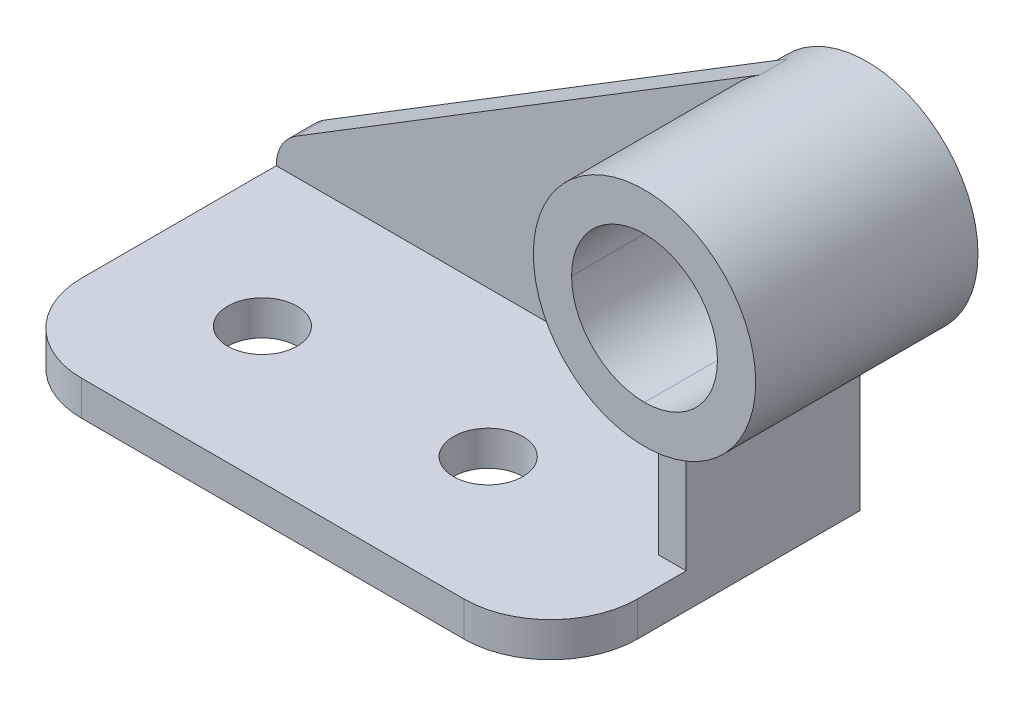
ISO-10303-21;
HEADER;
FILE_DESCRIPTION(('STEP AP214'),'2;1');
FILE_NAME('part.step','',(''),(''),'','','');
FILE_SCHEMA(('AUTOMOTIVE_DESIGN { 1 0 10303 214 1 1 1 1 }'));
ENDSEC;
DATA;
#1=APPLICATION_CONTEXT('core data for automotive mechanical design processes');
#2=APPLICATION_PROTOCOL_DEFINITION('international standard','automotive_design',2000,#1);
#3=PRODUCT_CONTEXT('',#1,'mechanical');
#4=PRODUCT('Part','Part','',(#3));
#5=PRODUCT_RELATED_PRODUCT_CATEGORY('part','',(#4));
#6=PRODUCT_DEFINITION_FORMATION('','',#4);
#7=PRODUCT_DEFINITION_CONTEXT('part definition',#1,'design');
#8=PRODUCT_DEFINITION('design','',#6,#7);
#9=PRODUCT_DEFINITION_SHAPE('','',#8);
#10=(LENGTH_UNIT() NAMED_UNIT(*) SI_UNIT(.MILLI.,.METRE.));
#11=(NAMED_UNIT(*) PLANE_ANGLE_UNIT() SI_UNIT($,.RADIAN.));
#12=(NAMED_UNIT(*) SI_UNIT($,.STERADIAN.) SOLID_ANGLE_UNIT());
#13=UNCERTAINTY_MEASURE_WITH_UNIT(LENGTH_MEASURE(1.E-05),#10,'distance_accuracy_value','');
#14=(GEOMETRIC_REPRESENTATION_CONTEXT(3) GLOBAL_UNCERTAINTY_ASSIGNED_CONTEXT((#13)) GLOBAL_UNIT_ASSIGNED_CONTEXT((#10,
#11,#12)) REPRESENTATION_CONTEXT('',''));
#15=CARTESIAN_POINT('',(0.,0.,0.));
#16=DIRECTION('',(0.,0.,1.));
#17=DIRECTION('',(1.,0.,0.));
#18=AXIS2_PLACEMENT_3D('',#15,#16,#17);
#19=CARTESIAN_POINT('',(156.,75.,0.));
#20=DIRECTION('',(0.,0.,-1.));
#21=DIRECTION('',(-1.,0.,0.));
#22=AXIS2_PLACEMENT_3D('',#19,#20,#21);
#23=CYLINDRICAL_SURFACE('',#22,21.);
#24=CARTESIAN_POINT('',(156.,75.,-31.));
#25=DIRECTION('',(0.,0.,-1.));
#26=DIRECTION('',(-1.,0.,0.));
#27=AXIS2_PLACEMENT_3D('',#24,#25,#26);
#28=CIRCLE('',#27,21.);
#29=CARTESIAN_POINT('',(177.,75.,-31.));
#30=VERTEX_POINT('',#29);
#31=CARTESIAN_POINT('',(156.,54.,-31.));
#32=VERTEX_POINT('',#31);
#33=EDGE_CURVE('E194',#30,#32,#28,.T.);
#34=ORIENTED_EDGE('',*,*,#33,.F.);
#35=DIRECTION('',(0.,0.,-1.));
#36=VECTOR('',#35,1.);
#37=CARTESIAN_POINT('',(177.,75.,0.));
#38=LINE('',#37,#36);
#39=CARTESIAN_POINT('',(177.,75.,-95.));
#40=VERTEX_POINT('',#39);
#41=EDGE_CURVE('E11',#30,#40,#38,.T.);
#42=ORIENTED_EDGE('',*,*,#41,.T.);
#43=CARTESIAN_POINT('',(156.,75.,-95.));
#44=DIRECTION('',(0.,0.,-1.));
#45=DIRECTION('',(-1.,0.,0.));
#46=AXIS2_PLACEMENT_3D('',#43,#44,#45);
#47=CIRCLE('',#46,21.);
#48=CARTESIAN_POINT('',(156.,54.,-95.));
#49=VERTEX_POINT('',#48);
#50=EDGE_CURVE('E188',#40,#49,#47,.T.);
#51=ORIENTED_EDGE('',*,*,#50,.T.);
#52=DIRECTION('',(0.,0.,-1.));
#53=VECTOR('',#52,1.);
#54=CARTESIAN_POINT('',(156.,54.,0.));
#55=LINE('',#54,#53);
#56=EDGE_CURVE('E334',#49,#32,#55,.F.);
#57=ORIENTED_EDGE('',*,*,#56,.T.);
#58=EDGE_LOOP('',(#34,#42,#51,#57));
#59=FACE_BOUND('',#58,.T.);
#60=ADVANCED_FACE('F44',(#59),#23,.F.);
#61=CARTESIAN_POINT('',(135.,75.,-95.));
#62=VERTEX_POINT('',#61);
#63=EDGE_CURVE('E189',#49,#62,#47,.T.);
#64=ORIENTED_EDGE('',*,*,#63,.T.);
#65=DIRECTION('',(0.,0.,-1.));
#66=VECTOR('',#65,1.);
#67=CARTESIAN_POINT('',(135.,75.,0.));
#68=LINE('',#67,#66);
#69=CARTESIAN_POINT('',(135.,75.,-31.));
#70=VERTEX_POINT('',#69);
#71=EDGE_CURVE('E48',#62,#70,#68,.F.);
#72=ORIENTED_EDGE('',*,*,#71,.T.);
#73=EDGE_CURVE('E195',#32,#70,#28,.T.);
#74=ORIENTED_EDGE('',*,*,#73,.F.);
#75=ORIENTED_EDGE('',*,*,#56,.F.);
#76=EDGE_LOOP('',(#64,#72,#74,#75));
#77=FACE_BOUND('',#76,.T.);
#78=ADVANCED_FACE('F353',(#77),#23,.F.);
#79=ORIENTED_EDGE('',*,*,#41,.F.);
#80=CARTESIAN_POINT('',(156.,96.,-31.));
#81=VERTEX_POINT('',#80);
#82=EDGE_CURVE('E190',#81,#30,#28,.T.);
#83=ORIENTED_EDGE('',*,*,#82,.F.);
#84=DIRECTION('',(0.,0.,-1.));
#85=VECTOR('',#84,1.);
#86=CARTESIAN_POINT('',(156.,96.,0.));
#87=LINE('',#86,#85);
#88=CARTESIAN_POINT('',(156.,96.,-95.));
#89=VERTEX_POINT('',#88);
#90=EDGE_CURVE('E224',#81,#89,#87,.T.);
#91=ORIENTED_EDGE('',*,*,#90,.T.);
#92=EDGE_CURVE('E185',#89,#40,#47,.T.);
#93=ORIENTED_EDGE('',*,*,#92,.T.);
#94=EDGE_LOOP('',(#79,#83,#91,#93));
#95=FACE_BOUND('',#94,.T.);
#96=ADVANCED_FACE('F367',(#95),#23,.F.);
#97=CARTESIAN_POINT('',(135.,10.,-25.));
#98=DIRECTION('',(0.,-1.,0.));
#99=DIRECTION('',(0.,0.,-1.));
#100=AXIS2_PLACEMENT_3D('',#97,#98,#99);
#101=PLANE('',#100);
#102=CARTESIAN_POINT('',(38.,10.,-39.));
#103=DIRECTION('',(0.,1.,0.));
#104=DIRECTION('',(0.,0.,1.));
#105=AXIS2_PLACEMENT_3D('',#102,#103,#104);
#106=CIRCLE('',#105,10.);
#107=CARTESIAN_POINT('',(38.,10.,-29.));
#108=VERTEX_POINT('',#107);
#109=EDGE_CURVE('E312',#108,#108,#106,.T.);
#110=ORIENTED_EDGE('',*,*,#109,.F.);
#111=EDGE_LOOP('',(#110));
#112=FACE_BOUND('',#111,.T.);
#113=DIRECTION('',(0.,0.,1.));
#114=VECTOR('',#113,1.);
#115=CARTESIAN_POINT('',(152.,10.,-81.));
#116=LINE('',#115,#114);
#117=CARTESIAN_POINT('',(152.,10.,-81.));
#118=VERTEX_POINT('',#117);
#119=CARTESIAN_POINT('',(152.,10.,-39.));
#120=VERTEX_POINT('',#119);
#121=EDGE_CURVE('E166',#118,#120,#116,.T.);
#122=ORIENTED_EDGE('',*,*,#121,.F.);
#123=DIRECTION('',(-1.,0.,0.));
#124=VECTOR('',#123,1.);
#125=CARTESIAN_POINT('',(160.,10.,-81.));
#126=LINE('',#125,#124);
#127=CARTESIAN_POINT('',(0.,10.,-81.));
#128=VERTEX_POINT('',#127);
#129=EDGE_CURVE('E151',#118,#128,#126,.T.);
#130=ORIENTED_EDGE('',*,*,#129,.T.);
#131=DIRECTION('',(0.,0.,-1.));
#132=VECTOR('',#131,1.);
#133=CARTESIAN_POINT('',(0.,10.,-25.));
#134=LINE('',#133,#132);
#135=CARTESIAN_POINT('',(0.,10.,-25.));
#136=VERTEX_POINT('',#135);
#137=EDGE_CURVE('E237',#136,#128,#134,.T.);
#138=ORIENTED_EDGE('',*,*,#137,.F.);
#139=CARTESIAN_POINT('',(25.,10.,-25.));
#140=DIRECTION('',(0.,-1.,0.));
#141=DIRECTION('',(0.,0.,-1.));
#142=AXIS2_PLACEMENT_3D('',#139,#140,#141);
#143=CIRCLE('',#142,25.);
#144=CARTESIAN_POINT('',(25.,10.,0.));
#145=VERTEX_POINT('',#144);
#146=EDGE_CURVE('E234',#145,#136,#143,.T.);
#147=ORIENTED_EDGE('',*,*,#146,.F.);
#148=DIRECTION('',(1.,0.,0.));
#149=VECTOR('',#148,1.);
#150=CARTESIAN_POINT('',(25.,10.,0.));
#151=LINE('',#150,#149);
#152=CARTESIAN_POINT('',(135.,10.,0.));
#153=VERTEX_POINT('',#152);
#154=EDGE_CURVE('E232',#145,#153,#151,.T.);
#155=ORIENTED_EDGE('',*,*,#154,.T.);
#156=CARTESIAN_POINT('',(135.,10.,-25.));
#157=DIRECTION('',(0.,-1.,0.));
#158=DIRECTION('',(0.,0.,-1.));
#159=AXIS2_PLACEMENT_3D('',#156,#157,#158);
#160=CIRCLE('',#159,25.);
#161=CARTESIAN_POINT('',(160.,10.,-25.));
#162=VERTEX_POINT('',#161);
#163=EDGE_CURVE('E222',#162,#153,#160,.T.);
#164=ORIENTED_EDGE('',*,*,#163,.F.);
#165=DIRECTION('',(0.,0.,1.));
#166=VECTOR('',#165,1.);
#167=CARTESIAN_POINT('',(160.,10.,-89.));
#168=LINE('',#167,#166);
#169=CARTESIAN_POINT('',(160.,10.,-39.));
#170=VERTEX_POINT('',#169);
#171=EDGE_CURVE('E219',#170,#162,#168,.T.);
#172=ORIENTED_EDGE('',*,*,#171,.F.);
#173=DIRECTION('',(-1.,0.,0.));
#174=VECTOR('',#173,1.);
#175=CARTESIAN_POINT('',(160.,10.,-39.));
#176=LINE('',#175,#174);
#177=EDGE_CURVE('E170',#170,#120,#176,.T.);
#178=ORIENTED_EDGE('',*,*,#177,.T.);
#179=EDGE_LOOP('',(#122,#130,#138,#147,#155,#164,#172,#178));
#180=FACE_BOUND('',#179,.T.);
#181=CARTESIAN_POINT('',(103.,10.,-39.));
#182=DIRECTION('',(0.,1.,0.));
#183=DIRECTION('',(0.,0.,1.));
#184=AXIS2_PLACEMENT_3D('',#181,#182,#183);
#185=CIRCLE('',#184,10.);
#186=CARTESIAN_POINT('',(103.,10.,-29.));
#187=VERTEX_POINT('',#186);
#188=EDGE_CURVE('E313',#187,#187,#185,.T.);
#189=ORIENTED_EDGE('',*,*,#188,.F.);
#190=EDGE_LOOP('',(#189));
#191=FACE_BOUND('',#190,.T.);
#192=ADVANCED_FACE('F167',(#112,#180,#191),#101,.F.);
#193=CARTESIAN_POINT('',(135.,0.,-25.));
#194=DIRECTION('',(0.,-1.,0.));
#195=DIRECTION('',(0.,0.,-1.));
#196=AXIS2_PLACEMENT_3D('',#193,#194,#195);
#197=PLANE('',#196);
#198=CARTESIAN_POINT('',(38.,0.,-39.));
#199=DIRECTION('',(0.,1.,0.));
#200=DIRECTION('',(0.,0.,1.));
#201=AXIS2_PLACEMENT_3D('',#198,#199,#200);
#202=CIRCLE('',#201,10.);
#203=CARTESIAN_POINT('',(38.,0.,-29.));
#204=VERTEX_POINT('',#203);
#205=EDGE_CURVE('E316',#204,#204,#202,.T.);
#206=ORIENTED_EDGE('',*,*,#205,.T.);
#207=EDGE_LOOP('',(#206));
#208=FACE_BOUND('',#207,.T.);
#209=DIRECTION('',(0.,0.,1.));
#210=VECTOR('',#209,1.);
#211=CARTESIAN_POINT('',(160.,0.,-89.));
#212=LINE('',#211,#210);
#213=CARTESIAN_POINT('',(160.,0.,-89.));
#214=VERTEX_POINT('',#213);
#215=CARTESIAN_POINT('',(160.,0.,-25.));
#216=VERTEX_POINT('',#215);
#217=EDGE_CURVE('E265',#214,#216,#212,.T.);
#218=ORIENTED_EDGE('',*,*,#217,.T.);
#219=CARTESIAN_POINT('',(135.,0.,-25.));
#220=DIRECTION('',(0.,-1.,0.));
#221=DIRECTION('',(0.,0.,-1.));
#222=AXIS2_PLACEMENT_3D('',#219,#220,#221);
#223=CIRCLE('',#222,25.);
#224=CARTESIAN_POINT('',(135.,0.,0.));
#225=VERTEX_POINT('',#224);
#226=EDGE_CURVE('E270',#216,#225,#223,.T.);
#227=ORIENTED_EDGE('',*,*,#226,.T.);
#228=DIRECTION('',(1.,0.,0.));
#229=VECTOR('',#228,1.);
#230=CARTESIAN_POINT('',(25.,0.,0.));
#231=LINE('',#230,#229);
#232=CARTESIAN_POINT('',(25.,0.,0.));
#233=VERTEX_POINT('',#232);
#234=EDGE_CURVE('E273',#233,#225,#231,.T.);
#235=ORIENTED_EDGE('',*,*,#234,.F.);
#236=CARTESIAN_POINT('',(25.,0.,-25.));
#237=DIRECTION('',(0.,-1.,0.));
#238=DIRECTION('',(0.,0.,-1.));
#239=AXIS2_PLACEMENT_3D('',#236,#237,#238);
#240=CIRCLE('',#239,25.);
#241=CARTESIAN_POINT('',(0.,0.,-25.));
#242=VERTEX_POINT('',#241);
#243=EDGE_CURVE('E276',#233,#242,#240,.T.);
#244=ORIENTED_EDGE('',*,*,#243,.T.);
#245=DIRECTION('',(0.,0.,-1.));
#246=VECTOR('',#245,1.);
#247=CARTESIAN_POINT('',(0.,0.,-25.));
#248=LINE('',#247,#246);
#249=CARTESIAN_POINT('',(0.,0.,-89.));
#250=VERTEX_POINT('',#249);
#251=EDGE_CURVE('E278',#242,#250,#248,.T.);
#252=ORIENTED_EDGE('',*,*,#251,.T.);
#253=DIRECTION('',(-1.,0.,0.));
#254=VECTOR('',#253,1.);
#255=CARTESIAN_POINT('',(160.,0.,-89.));
#256=LINE('',#255,#254);
#257=EDGE_CURVE('E223',#214,#250,#256,.T.);
#258=ORIENTED_EDGE('',*,*,#257,.F.);
#259=EDGE_LOOP('',(#218,#227,#235,#244,#252,#258));
#260=FACE_BOUND('',#259,.T.);
#261=CARTESIAN_POINT('',(103.,0.,-39.));
#262=DIRECTION('',(0.,1.,0.));
#263=DIRECTION('',(0.,0.,1.));
#264=AXIS2_PLACEMENT_3D('',#261,#262,#263);
#265=CIRCLE('',#264,10.);
#266=CARTESIAN_POINT('',(103.,0.,-29.));
#267=VERTEX_POINT('',#266);
#268=EDGE_CURVE('E310',#267,#267,#265,.T.);
#269=ORIENTED_EDGE('',*,*,#268,.T.);
#270=EDGE_LOOP('',(#269));
#271=FACE_BOUND('',#270,.T.);
#272=ADVANCED_FACE('F303',(#208,#260,#271),#197,.T.);
#273=CARTESIAN_POINT('',(156.,75.,-81.));
#274=DIRECTION('',(0.,0.,-1.));
#275=DIRECTION('',(-1.,0.,0.));
#276=AXIS2_PLACEMENT_3D('',#273,#274,#275);
#277=PLANE('',#276);
#278=CARTESIAN_POINT('',(156.,75.,-81.));
#279=DIRECTION('',(0.,0.,-1.));
#280=DIRECTION('',(-1.,0.,0.));
#281=AXIS2_PLACEMENT_3D('',#278,#279,#280);
#282=CIRCLE('',#281,32.);
#283=CARTESIAN_POINT('',(152.,43.2509842672249,-81.));
#284=VERTEX_POINT('',#283);
#285=CARTESIAN_POINT('',(139.248405558681,102.265070762306,-81.));
#286=VERTEX_POINT('',#285);
#287=EDGE_CURVE('E217',#284,#286,#282,.T.);
#288=ORIENTED_EDGE('',*,*,#287,.T.);
#289=DIRECTION('',(0.852033461322075,0.523487326291214,0.));
#290=VECTOR('',#289,1.);
#291=CARTESIAN_POINT('',(5.71815208450543,20.2244015358649,-81.));
#292=LINE('',#291,#290);
#293=CARTESIAN_POINT('',(5.71815208450543,20.2244015358649,-81.));
#294=VERTEX_POINT('',#293);
#295=EDGE_CURVE('E208',#294,#286,#292,.T.);
#296=ORIENTED_EDGE('',*,*,#295,.F.);
#297=CARTESIAN_POINT('',(12.,10.,-81.));
#298=DIRECTION('',(0.,0.,-1.));
#299=DIRECTION('',(-1.,0.,0.));
#300=AXIS2_PLACEMENT_3D('',#297,#298,#299);
#301=CIRCLE('',#300,12.);
#302=EDGE_CURVE('E159',#128,#294,#301,.T.);
#303=ORIENTED_EDGE('',*,*,#302,.F.);
#304=ORIENTED_EDGE('',*,*,#129,.F.);
#305=DIRECTION('',(0.,-1.,0.));
#306=VECTOR('',#305,1.);
#307=CARTESIAN_POINT('',(152.,107.001,-81.));
#308=LINE('',#307,#306);
#309=EDGE_CURVE('E155',#284,#118,#308,.T.);
#310=ORIENTED_EDGE('',*,*,#309,.F.);
#311=EDGE_LOOP('',(#288,#296,#303,#304,#310));
#312=FACE_BOUND('',#311,.T.);
#313=ADVANCED_FACE('F153',(#312),#277,.F.);
#314=CARTESIAN_POINT('',(160.,10.,-89.));
#315=DIRECTION('',(1.,0.,0.));
#316=DIRECTION('',(0.,0.,-1.));
#317=AXIS2_PLACEMENT_3D('',#314,#315,#316);
#318=PLANE('',#317);
#319=DIRECTION('',(0.,-1.,0.));
#320=VECTOR('',#319,1.);
#321=CARTESIAN_POINT('',(160.,107.001,-39.));
#322=LINE('',#321,#320);
#323=CARTESIAN_POINT('',(160.,43.2509842672249,-39.));
#324=VERTEX_POINT('',#323);
#325=EDGE_CURVE('E180',#324,#170,#322,.T.);
#326=ORIENTED_EDGE('',*,*,#325,.T.);
#327=ORIENTED_EDGE('',*,*,#171,.T.);
#328=DIRECTION('',(0.,-1.,0.));
#329=VECTOR('',#328,1.);
#330=CARTESIAN_POINT('',(160.,10.,-25.));
#331=LINE('',#330,#329);
#332=EDGE_CURVE('E246',#162,#216,#331,.T.);
#333=ORIENTED_EDGE('',*,*,#332,.T.);
#334=ORIENTED_EDGE('',*,*,#217,.F.);
#335=DIRECTION('',(0.,-1.,0.));
#336=VECTOR('',#335,1.);
#337=CARTESIAN_POINT('',(160.,10.,-89.));
#338=LINE('',#337,#336);
#339=CARTESIAN_POINT('',(160.,43.2509842672249,-89.));
#340=VERTEX_POINT('',#339);
#341=EDGE_CURVE('E240',#340,#214,#338,.T.);
#342=ORIENTED_EDGE('',*,*,#341,.F.);
#343=DIRECTION('',(0.,0.,-1.));
#344=VECTOR('',#343,1.);
#345=CARTESIAN_POINT('',(160.,43.2509842672249,-81.));
#346=LINE('',#345,#344);
#347=EDGE_CURVE('E260',#324,#340,#346,.T.);
#348=ORIENTED_EDGE('',*,*,#347,.F.);
#349=EDGE_LOOP('',(#326,#327,#333,#334,#342,#348));
#350=FACE_BOUND('',#349,.T.);
#351=ADVANCED_FACE('F46',(#350),#318,.T.);
#352=CARTESIAN_POINT('',(160.,10.,-89.));
#353=DIRECTION('',(0.,0.,1.));
#354=DIRECTION('',(1.,0.,0.));
#355=AXIS2_PLACEMENT_3D('',#352,#353,#354);
#356=PLANE('',#355);
#357=CARTESIAN_POINT('',(156.,75.,-89.));
#358=DIRECTION('',(0.,0.,1.));
#359=DIRECTION('',(1.,0.,0.));
#360=AXIS2_PLACEMENT_3D('',#357,#358,#359);
#361=CIRCLE('',#360,32.);
#362=CARTESIAN_POINT('',(139.248405558681,102.265070762306,-89.));
#363=VERTEX_POINT('',#362);
#364=EDGE_CURVE('E201',#363,#340,#361,.T.);
#365=ORIENTED_EDGE('',*,*,#364,.T.);
#366=ORIENTED_EDGE('',*,*,#341,.T.);
#367=ORIENTED_EDGE('',*,*,#257,.T.);
#368=DIRECTION('',(0.,-1.,0.));
#369=VECTOR('',#368,1.);
#370=CARTESIAN_POINT('',(0.,10.,-89.));
#371=LINE('',#370,#369);
#372=CARTESIAN_POINT('',(0.,10.,-89.));
#373=VERTEX_POINT('',#372);
#374=EDGE_CURVE('E285',#373,#250,#371,.T.);
#375=ORIENTED_EDGE('',*,*,#374,.F.);
#376=CARTESIAN_POINT('',(12.,10.,-89.));
#377=DIRECTION('',(0.,0.,-1.));
#378=DIRECTION('',(-1.,0.,0.));
#379=AXIS2_PLACEMENT_3D('',#376,#377,#378);
#380=CIRCLE('',#379,12.);
#381=CARTESIAN_POINT('',(5.71815208450543,20.2244015358649,-89.));
#382=VERTEX_POINT('',#381);
#383=EDGE_CURVE('E205',#373,#382,#380,.T.);
#384=ORIENTED_EDGE('',*,*,#383,.T.);
#385=DIRECTION('',(0.852033461322075,0.523487326291214,0.));
#386=VECTOR('',#385,1.);
#387=CARTESIAN_POINT('',(5.71815208450543,20.2244015358649,-89.));
#388=LINE('',#387,#386);
#389=EDGE_CURVE('E203',#382,#363,#388,.T.);
#390=ORIENTED_EDGE('',*,*,#389,.T.);
#391=EDGE_LOOP('',(#365,#366,#367,#375,#384,#390));
#392=FACE_BOUND('',#391,.T.);
#393=ADVANCED_FACE('F284',(#392),#356,.F.);
#394=CARTESIAN_POINT('',(0.,10.,-25.));
#395=DIRECTION('',(-1.,0.,0.));
#396=DIRECTION('',(0.,0.,1.));
#397=AXIS2_PLACEMENT_3D('',#394,#395,#396);
#398=PLANE('',#397);
#399=ORIENTED_EDGE('',*,*,#251,.F.);
#400=DIRECTION('',(0.,-1.,0.));
#401=VECTOR('',#400,1.);
#402=CARTESIAN_POINT('',(0.,10.,-25.));
#403=LINE('',#402,#401);
#404=EDGE_CURVE('E289',#136,#242,#403,.T.);
#405=ORIENTED_EDGE('',*,*,#404,.F.);
#406=ORIENTED_EDGE('',*,*,#137,.T.);
#407=DIRECTION('',(0.,0.,-1.));
#408=VECTOR('',#407,1.);
#409=CARTESIAN_POINT('',(0.,10.,-81.));
#410=LINE('',#409,#408);
#411=EDGE_CURVE('E163',#128,#373,#410,.T.);
#412=ORIENTED_EDGE('',*,*,#411,.T.);
#413=ORIENTED_EDGE('',*,*,#374,.T.);
#414=EDGE_LOOP('',(#399,#405,#406,#412,#413));
#415=FACE_BOUND('',#414,.T.);
#416=ADVANCED_FACE('F288',(#415),#398,.T.);
#417=CARTESIAN_POINT('',(25.,10.,-25.));
#418=DIRECTION('',(0.,-1.,0.));
#419=DIRECTION('',(0.,0.,-1.));
#420=AXIS2_PLACEMENT_3D('',#417,#418,#419);
#421=CYLINDRICAL_SURFACE('',#420,25.);
#422=ORIENTED_EDGE('',*,*,#243,.F.);
#423=DIRECTION('',(0.,-1.,0.));
#424=VECTOR('',#423,1.);
#425=CARTESIAN_POINT('',(25.,10.,0.));
#426=LINE('',#425,#424);
#427=EDGE_CURVE('E290',#145,#233,#426,.T.);
#428=ORIENTED_EDGE('',*,*,#427,.F.);
#429=ORIENTED_EDGE('',*,*,#146,.T.);
#430=ORIENTED_EDGE('',*,*,#404,.T.);
#431=EDGE_LOOP('',(#422,#428,#429,#430));
#432=FACE_BOUND('',#431,.T.);
#433=ADVANCED_FACE('F393',(#432),#421,.T.);
#434=CARTESIAN_POINT('',(25.,10.,0.));
#435=DIRECTION('',(0.,0.,-1.));
#436=DIRECTION('',(-1.,0.,0.));
#437=AXIS2_PLACEMENT_3D('',#434,#435,#436);
#438=PLANE('',#437);
#439=ORIENTED_EDGE('',*,*,#234,.T.);
#440=DIRECTION('',(0.,-1.,0.));
#441=VECTOR('',#440,1.);
#442=CARTESIAN_POINT('',(135.,10.,0.));
#443=LINE('',#442,#441);
#444=EDGE_CURVE('E293',#153,#225,#443,.T.);
#445=ORIENTED_EDGE('',*,*,#444,.F.);
#446=ORIENTED_EDGE('',*,*,#154,.F.);
#447=ORIENTED_EDGE('',*,*,#427,.T.);
#448=EDGE_LOOP('',(#439,#445,#446,#447));
#449=FACE_BOUND('',#448,.T.);
#450=ADVANCED_FACE('F396',(#449),#438,.F.);
#451=CARTESIAN_POINT('',(135.,10.,-25.));
#452=DIRECTION('',(0.,-1.,0.));
#453=DIRECTION('',(0.,0.,-1.));
#454=AXIS2_PLACEMENT_3D('',#451,#452,#453);
#455=CYLINDRICAL_SURFACE('',#454,25.);
#456=ORIENTED_EDGE('',*,*,#226,.F.);
#457=ORIENTED_EDGE('',*,*,#332,.F.);
#458=ORIENTED_EDGE('',*,*,#163,.T.);
#459=ORIENTED_EDGE('',*,*,#444,.T.);
#460=EDGE_LOOP('',(#456,#457,#458,#459));
#461=FACE_BOUND('',#460,.T.);
#462=ADVANCED_FACE('F301',(#461),#455,.T.);
#463=CARTESIAN_POINT('',(156.,75.,-81.));
#464=DIRECTION('',(0.,0.,-1.));
#465=DIRECTION('',(-1.,0.,0.));
#466=AXIS2_PLACEMENT_3D('',#463,#464,#465);
#467=CYLINDRICAL_SURFACE('',#466,32.);
#468=CARTESIAN_POINT('',(156.,75.,-95.));
#469=DIRECTION('',(0.,0.,-1.));
#470=DIRECTION('',(-1.,0.,0.));
#471=AXIS2_PLACEMENT_3D('',#468,#469,#470);
#472=CIRCLE('',#471,32.);
#473=CARTESIAN_POINT('',(124.,75.,-95.));
#474=VERTEX_POINT('',#473);
#475=EDGE_CURVE('E193',#474,#474,#472,.T.);
#476=ORIENTED_EDGE('',*,*,#475,.F.);
#477=EDGE_LOOP('',(#476));
#478=FACE_BOUND('',#477,.T.);
#479=ORIENTED_EDGE('',*,*,#347,.T.);
#480=ORIENTED_EDGE('',*,*,#364,.F.);
#481=DIRECTION('',(0.,0.,-1.));
#482=VECTOR('',#481,1.);
#483=CARTESIAN_POINT('',(139.248405558681,102.265070762306,-81.));
#484=LINE('',#483,#482);
#485=EDGE_CURVE('E256',#286,#363,#484,.T.);
#486=ORIENTED_EDGE('',*,*,#485,.F.);
#487=ORIENTED_EDGE('',*,*,#287,.F.);
#488=DIRECTION('',(0.,0.,-1.));
#489=VECTOR('',#488,1.);
#490=CARTESIAN_POINT('',(152.,43.2509842672249,-81.));
#491=LINE('',#490,#489);
#492=CARTESIAN_POINT('',(152.,43.2509842672249,-39.));
#493=VERTEX_POINT('',#492);
#494=EDGE_CURVE('E178',#493,#284,#491,.T.);
#495=ORIENTED_EDGE('',*,*,#494,.F.);
#496=CARTESIAN_POINT('',(156.,75.,-39.));
#497=DIRECTION('',(0.,0.,1.));
#498=DIRECTION('',(1.,0.,0.));
#499=AXIS2_PLACEMENT_3D('',#496,#497,#498);
#500=CIRCLE('',#499,32.);
#501=EDGE_CURVE('E324',#493,#324,#500,.T.);
#502=ORIENTED_EDGE('',*,*,#501,.T.);
#503=EDGE_LOOP('',(#479,#480,#486,#487,#495,#502));
#504=FACE_BOUND('',#503,.T.);
#505=CARTESIAN_POINT('',(156.,75.,-31.));
#506=DIRECTION('',(0.,0.,-1.));
#507=DIRECTION('',(-1.,0.,0.));
#508=AXIS2_PLACEMENT_3D('',#505,#506,#507);
#509=CIRCLE('',#508,32.);
#510=CARTESIAN_POINT('',(124.,75.,-31.));
#511=VERTEX_POINT('',#510);
#512=EDGE_CURVE('E198',#511,#511,#509,.T.);
#513=ORIENTED_EDGE('',*,*,#512,.T.);
#514=EDGE_LOOP('',(#513));
#515=FACE_BOUND('',#514,.T.);
#516=ADVANCED_FACE('F332',(#478,#504,#515),#467,.T.);
#517=CARTESIAN_POINT('',(5.71815208450543,20.2244015358649,-81.));
#518=DIRECTION('',(-0.523487326291215,0.852033461322075,0.));
#519=DIRECTION('',(-0.852033461322075,-0.523487326291215,0.));
#520=AXIS2_PLACEMENT_3D('',#517,#518,#519);
#521=PLANE('',#520);
#522=ORIENTED_EDGE('',*,*,#485,.T.);
#523=ORIENTED_EDGE('',*,*,#389,.F.);
#524=DIRECTION('',(0.,0.,-1.));
#525=VECTOR('',#524,1.);
#526=CARTESIAN_POINT('',(5.71815208450543,20.2244015358649,-81.));
#527=LINE('',#526,#525);
#528=EDGE_CURVE('E213',#294,#382,#527,.T.);
#529=ORIENTED_EDGE('',*,*,#528,.F.);
#530=ORIENTED_EDGE('',*,*,#295,.T.);
#531=EDGE_LOOP('',(#522,#523,#529,#530));
#532=FACE_BOUND('',#531,.T.);
#533=ADVANCED_FACE('F404',(#532),#521,.T.);
#534=CARTESIAN_POINT('',(12.,10.,-81.));
#535=DIRECTION('',(0.,0.,-1.));
#536=DIRECTION('',(-1.,0.,0.));
#537=AXIS2_PLACEMENT_3D('',#534,#535,#536);
#538=CYLINDRICAL_SURFACE('',#537,12.);
#539=ORIENTED_EDGE('',*,*,#383,.F.);
#540=ORIENTED_EDGE('',*,*,#411,.F.);
#541=ORIENTED_EDGE('',*,*,#302,.T.);
#542=ORIENTED_EDGE('',*,*,#528,.T.);
#543=EDGE_LOOP('',(#539,#540,#541,#542));
#544=FACE_BOUND('',#543,.T.);
#545=ADVANCED_FACE('F409',(#544),#538,.T.);
#546=CARTESIAN_POINT('',(156.,75.,-31.));
#547=DIRECTION('',(0.,0.,-1.));
#548=DIRECTION('',(-1.,0.,0.));
#549=AXIS2_PLACEMENT_3D('',#546,#547,#548);
#550=PLANE('',#549);
#551=ORIENTED_EDGE('',*,*,#82,.T.);
#552=ORIENTED_EDGE('',*,*,#33,.T.);
#553=ORIENTED_EDGE('',*,*,#73,.T.);
#554=EDGE_CURVE('E187',#70,#81,#28,.T.);
#555=ORIENTED_EDGE('',*,*,#554,.T.);
#556=EDGE_LOOP('',(#551,#552,#553,#555));
#557=FACE_BOUND('',#556,.T.);
#558=ORIENTED_EDGE('',*,*,#512,.F.);
#559=EDGE_LOOP('',(#558));
#560=FACE_BOUND('',#559,.T.);
#561=ADVANCED_FACE('F360',(#557,#560),#550,.F.);
#562=CARTESIAN_POINT('',(156.,75.,-95.));
#563=DIRECTION('',(0.,0.,-1.));
#564=DIRECTION('',(-1.,0.,0.));
#565=AXIS2_PLACEMENT_3D('',#562,#563,#564);
#566=PLANE('',#565);
#567=ORIENTED_EDGE('',*,*,#50,.F.);
#568=ORIENTED_EDGE('',*,*,#92,.F.);
#569=EDGE_CURVE('E325',#62,#89,#47,.T.);
#570=ORIENTED_EDGE('',*,*,#569,.F.);
#571=ORIENTED_EDGE('',*,*,#63,.F.);
#572=EDGE_LOOP('',(#567,#568,#570,#571));
#573=FACE_BOUND('',#572,.T.);
#574=ORIENTED_EDGE('',*,*,#475,.T.);
#575=EDGE_LOOP('',(#574));
#576=FACE_BOUND('',#575,.T.);
#577=ADVANCED_FACE('F371',(#573,#576),#566,.T.);
#578=ORIENTED_EDGE('',*,*,#71,.F.);
#579=ORIENTED_EDGE('',*,*,#569,.T.);
#580=ORIENTED_EDGE('',*,*,#90,.F.);
#581=ORIENTED_EDGE('',*,*,#554,.F.);
#582=EDGE_LOOP('',(#578,#579,#580,#581));
#583=FACE_BOUND('',#582,.T.);
#584=ADVANCED_FACE('F358',(#583),#23,.F.);
#585=CARTESIAN_POINT('',(152.,107.001,-81.));
#586=DIRECTION('',(1.,0.,0.));
#587=DIRECTION('',(0.,0.,-1.));
#588=AXIS2_PLACEMENT_3D('',#585,#586,#587);
#589=PLANE('',#588);
#590=DIRECTION('',(0.,-1.,0.));
#591=VECTOR('',#590,1.);
#592=CARTESIAN_POINT('',(152.,107.001,-39.));
#593=LINE('',#592,#591);
#594=EDGE_CURVE('E174',#493,#120,#593,.T.);
#595=ORIENTED_EDGE('',*,*,#594,.F.);
#596=ORIENTED_EDGE('',*,*,#494,.T.);
#597=ORIENTED_EDGE('',*,*,#309,.T.);
#598=ORIENTED_EDGE('',*,*,#121,.T.);
#599=EDGE_LOOP('',(#595,#596,#597,#598));
#600=FACE_BOUND('',#599,.T.);
#601=ADVANCED_FACE('F177',(#600),#589,.F.);
#602=CARTESIAN_POINT('',(160.,107.001,-39.));
#603=DIRECTION('',(0.,0.,1.));
#604=DIRECTION('',(1.,0.,0.));
#605=AXIS2_PLACEMENT_3D('',#602,#603,#604);
#606=PLANE('',#605);
#607=ORIENTED_EDGE('',*,*,#594,.T.);
#608=ORIENTED_EDGE('',*,*,#177,.F.);
#609=ORIENTED_EDGE('',*,*,#325,.F.);
#610=ORIENTED_EDGE('',*,*,#501,.F.);
#611=EDGE_LOOP('',(#607,#608,#609,#610));
#612=FACE_BOUND('',#611,.T.);
#613=ADVANCED_FACE('F328',(#612),#606,.T.);
#614=CARTESIAN_POINT('',(38.,10.,-39.));
#615=DIRECTION('',(0.,1.,0.));
#616=DIRECTION('',(0.,0.,1.));
#617=AXIS2_PLACEMENT_3D('',#614,#615,#616);
#618=CYLINDRICAL_SURFACE('',#617,10.);
#619=ORIENTED_EDGE('',*,*,#109,.T.);
#620=EDGE_LOOP('',(#619));
#621=FACE_BOUND('',#620,.T.);
#622=ORIENTED_EDGE('',*,*,#205,.F.);
#623=EDGE_LOOP('',(#622));
#624=FACE_BOUND('',#623,.T.);
#625=ADVANCED_FACE('F458',(#621,#624),#618,.F.);
#626=CARTESIAN_POINT('',(103.,10.,-39.));
#627=DIRECTION('',(0.,1.,0.));
#628=DIRECTION('',(0.,0.,1.));
#629=AXIS2_PLACEMENT_3D('',#626,#627,#628);
#630=CYLINDRICAL_SURFACE('',#629,10.);
#631=ORIENTED_EDGE('',*,*,#188,.T.);
#632=EDGE_LOOP('',(#631));
#633=FACE_BOUND('',#632,.T.);
#634=ORIENTED_EDGE('',*,*,#268,.F.);
#635=EDGE_LOOP('',(#634));
#636=FACE_BOUND('',#635,.T.);
#637=ADVANCED_FACE('F452',(#633,#636),#630,.F.);
#638=CLOSED_SHELL('',(#60,#78,#96,#192,#272,#313,#351,#393,#416,#433,#450,#462,#516,#533,#545,
#561,#577,#584,#601,#613,#625,#637));
#639=MANIFOLD_SOLID_BREP('B2',#638);
#640=ADVANCED_BREP_SHAPE_REPRESENTATION('',(#18,#639),#14);
#641=SHAPE_DEFINITION_REPRESENTATION(#9,#640);
ENDSEC;
END-ISO-10303-21;
